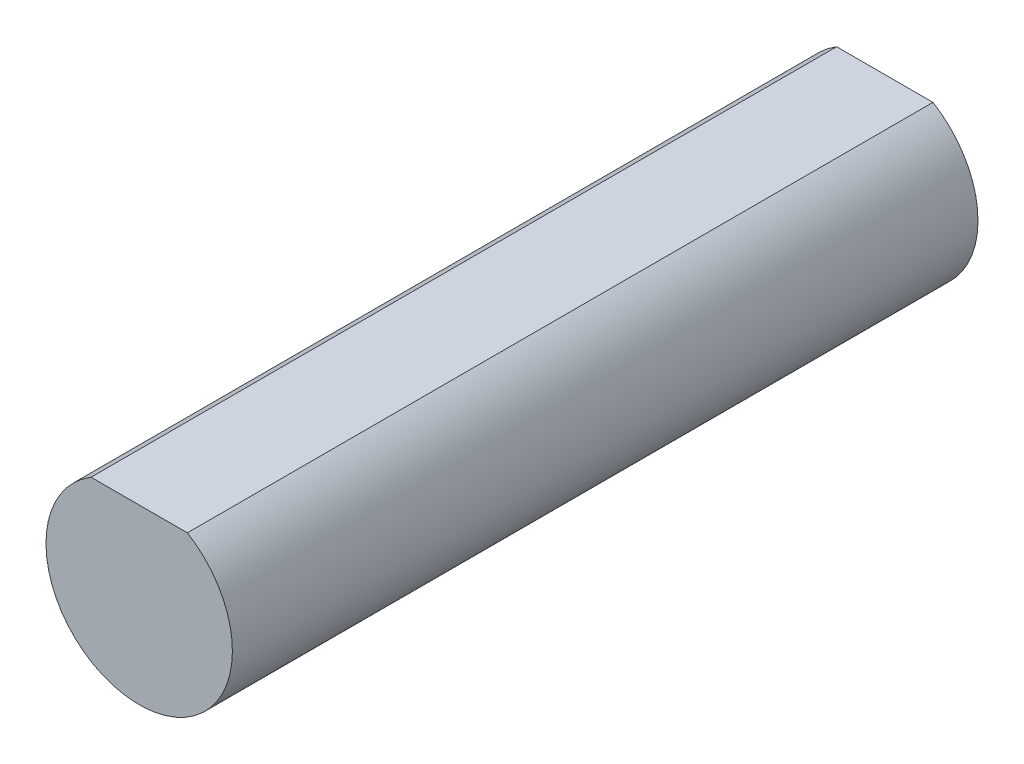
ISO-10303-21;
HEADER;
FILE_DESCRIPTION(('STEP AP214'),'2;1');
FILE_NAME('part.step','',(''),(''),'','','');
FILE_SCHEMA(('AUTOMOTIVE_DESIGN { 1 0 10303 214 1 1 1 1 }'));
ENDSEC;
DATA;
#1=APPLICATION_CONTEXT('core data for automotive mechanical design processes');
#2=APPLICATION_PROTOCOL_DEFINITION('international standard','automotive_design',2000,#1);
#3=PRODUCT_CONTEXT('',#1,'mechanical');
#4=PRODUCT('Part','Part','',(#3));
#5=PRODUCT_RELATED_PRODUCT_CATEGORY('part','',(#4));
#6=PRODUCT_DEFINITION_FORMATION('','',#4);
#7=PRODUCT_DEFINITION_CONTEXT('part definition',#1,'design');
#8=PRODUCT_DEFINITION('design','',#6,#7);
#9=PRODUCT_DEFINITION_SHAPE('','',#8);
#10=(LENGTH_UNIT() NAMED_UNIT(*) SI_UNIT(.MILLI.,.METRE.));
#11=(NAMED_UNIT(*) PLANE_ANGLE_UNIT() SI_UNIT($,.RADIAN.));
#12=(NAMED_UNIT(*) SI_UNIT($,.STERADIAN.) SOLID_ANGLE_UNIT());
#13=UNCERTAINTY_MEASURE_WITH_UNIT(LENGTH_MEASURE(1.E-05),#10,'distance_accuracy_value','');
#14=(GEOMETRIC_REPRESENTATION_CONTEXT(3) GLOBAL_UNCERTAINTY_ASSIGNED_CONTEXT((#13)) GLOBAL_UNIT_ASSIGNED_CONTEXT((#10,
#11,#12)) REPRESENTATION_CONTEXT('',''));
#15=CARTESIAN_POINT('',(0.,0.,0.));
#16=DIRECTION('',(0.,0.,1.));
#17=DIRECTION('',(1.,0.,0.));
#18=AXIS2_PLACEMENT_3D('',#15,#16,#17);
#19=CARTESIAN_POINT('',(0.,0.,25.4));
#20=DIRECTION('',(0.,0.,-1.));
#21=DIRECTION('',(-1.,0.,0.));
#22=AXIS2_PLACEMENT_3D('',#19,#20,#21);
#23=CYLINDRICAL_SURFACE('',#22,3.175);
#24=CARTESIAN_POINT('',(0.,0.,25.4));
#25=DIRECTION('',(0.,0.,1.));
#26=DIRECTION('',(1.,0.,0.));
#27=AXIS2_PLACEMENT_3D('',#24,#25,#26);
#28=CIRCLE('',#27,3.175);
#29=CARTESIAN_POINT('',(-1.6413982332146,2.7178,25.4));
#30=VERTEX_POINT('',#29);
#31=CARTESIAN_POINT('',(1.6413982332146,2.7178,25.4));
#32=VERTEX_POINT('',#31);
#33=EDGE_CURVE('E11',#30,#32,#28,.T.);
#34=ORIENTED_EDGE('',*,*,#33,.F.);
#35=DIRECTION('',(0.,0.,-1.));
#36=VECTOR('',#35,1.);
#37=CARTESIAN_POINT('',(-1.6413982332146,2.7178,25.4));
#38=LINE('',#37,#36);
#39=CARTESIAN_POINT('',(-1.6413982332146,2.7178,0.));
#40=VERTEX_POINT('',#39);
#41=EDGE_CURVE('E63',#30,#40,#38,.T.);
#42=ORIENTED_EDGE('',*,*,#41,.T.);
#43=CARTESIAN_POINT('',(0.,0.,0.));
#44=DIRECTION('',(0.,0.,1.));
#45=DIRECTION('',(1.,0.,0.));
#46=AXIS2_PLACEMENT_3D('',#43,#44,#45);
#47=CIRCLE('',#46,3.175);
#48=CARTESIAN_POINT('',(1.6413982332146,2.7178,0.));
#49=VERTEX_POINT('',#48);
#50=EDGE_CURVE('E45',#40,#49,#47,.T.);
#51=ORIENTED_EDGE('',*,*,#50,.T.);
#52=DIRECTION('',(0.,0.,-1.));
#53=VECTOR('',#52,1.);
#54=CARTESIAN_POINT('',(1.6413982332146,2.7178,25.4));
#55=LINE('',#54,#53);
#56=EDGE_CURVE('E57',#32,#49,#55,.T.);
#57=ORIENTED_EDGE('',*,*,#56,.F.);
#58=EDGE_LOOP('',(#34,#42,#51,#57));
#59=FACE_BOUND('',#58,.T.);
#60=ADVANCED_FACE('F42',(#59),#23,.T.);
#61=CARTESIAN_POINT('',(0.,0.,25.4));
#62=DIRECTION('',(0.,0.,1.));
#63=DIRECTION('',(1.,0.,0.));
#64=AXIS2_PLACEMENT_3D('',#61,#62,#63);
#65=PLANE('',#64);
#66=DIRECTION('',(-1.,0.,0.));
#67=VECTOR('',#66,1.);
#68=CARTESIAN_POINT('',(1.6413982332146,2.7178,25.4));
#69=LINE('',#68,#67);
#70=EDGE_CURVE('E73',#32,#30,#69,.T.);
#71=ORIENTED_EDGE('',*,*,#70,.T.);
#72=ORIENTED_EDGE('',*,*,#33,.T.);
#73=EDGE_LOOP('',(#71,#72));
#74=FACE_BOUND('',#73,.T.);
#75=ADVANCED_FACE('F86',(#74),#65,.T.);
#76=CARTESIAN_POINT('',(0.,0.,0.));
#77=DIRECTION('',(0.,0.,1.));
#78=DIRECTION('',(1.,0.,0.));
#79=AXIS2_PLACEMENT_3D('',#76,#77,#78);
#80=PLANE('',#79);
#81=ORIENTED_EDGE('',*,*,#50,.F.);
#82=DIRECTION('',(-1.,0.,0.));
#83=VECTOR('',#82,1.);
#84=CARTESIAN_POINT('',(1.6413982332146,2.7178,0.));
#85=LINE('',#84,#83);
#86=EDGE_CURVE('E67',#49,#40,#85,.T.);
#87=ORIENTED_EDGE('',*,*,#86,.F.);
#88=EDGE_LOOP('',(#81,#87));
#89=FACE_BOUND('',#88,.T.);
#90=ADVANCED_FACE('F79',(#89),#80,.F.);
#91=CARTESIAN_POINT('',(1.6413982332146,2.7178,25.4));
#92=DIRECTION('',(0.,-1.,0.));
#93=DIRECTION('',(0.,0.,-1.));
#94=AXIS2_PLACEMENT_3D('',#91,#92,#93);
#95=PLANE('',#94);
#96=ORIENTED_EDGE('',*,*,#86,.T.);
#97=ORIENTED_EDGE('',*,*,#41,.F.);
#98=ORIENTED_EDGE('',*,*,#70,.F.);
#99=ORIENTED_EDGE('',*,*,#56,.T.);
#100=EDGE_LOOP('',(#96,#97,#98,#99));
#101=FACE_BOUND('',#100,.T.);
#102=ADVANCED_FACE('F68',(#101),#95,.F.);
#103=CLOSED_SHELL('',(#60,#75,#90,#102));
#104=MANIFOLD_SOLID_BREP('B2',#103);
#105=ADVANCED_BREP_SHAPE_REPRESENTATION('',(#18,#104),#14);
#106=SHAPE_DEFINITION_REPRESENTATION(#9,#105);
ENDSEC;
END-ISO-10303-21;
